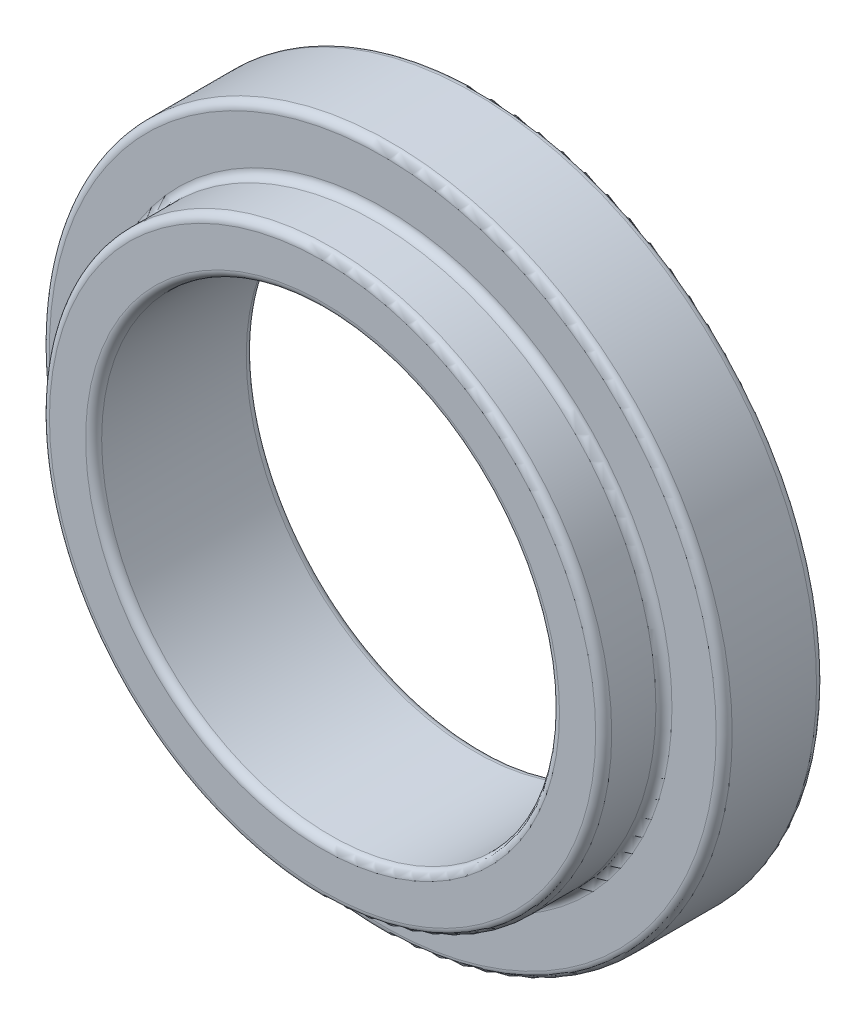
ISO-10303-21;
HEADER;
FILE_DESCRIPTION(('STEP AP214'),'2;1');
FILE_NAME('part.step','',(''),(''),'','','');
FILE_SCHEMA(('AUTOMOTIVE_DESIGN { 1 0 10303 214 1 1 1 1 }'));
ENDSEC;
DATA;
#1=APPLICATION_CONTEXT('core data for automotive mechanical design processes');
#2=APPLICATION_PROTOCOL_DEFINITION('international standard','automotive_design',2000,#1);
#3=PRODUCT_CONTEXT('',#1,'mechanical');
#4=PRODUCT('Part','Part','',(#3));
#5=PRODUCT_RELATED_PRODUCT_CATEGORY('part','',(#4));
#6=PRODUCT_DEFINITION_FORMATION('','',#4);
#7=PRODUCT_DEFINITION_CONTEXT('part definition',#1,'design');
#8=PRODUCT_DEFINITION('design','',#6,#7);
#9=PRODUCT_DEFINITION_SHAPE('','',#8);
#10=(LENGTH_UNIT() NAMED_UNIT(*) SI_UNIT(.MILLI.,.METRE.));
#11=(NAMED_UNIT(*) PLANE_ANGLE_UNIT() SI_UNIT($,.RADIAN.));
#12=(NAMED_UNIT(*) SI_UNIT($,.STERADIAN.) SOLID_ANGLE_UNIT());
#13=UNCERTAINTY_MEASURE_WITH_UNIT(LENGTH_MEASURE(1.E-05),#10,'distance_accuracy_value','');
#14=(GEOMETRIC_REPRESENTATION_CONTEXT(3) GLOBAL_UNCERTAINTY_ASSIGNED_CONTEXT((#13)) GLOBAL_UNIT_ASSIGNED_CONTEXT((#10,
#11,#12)) REPRESENTATION_CONTEXT('',''));
#15=CARTESIAN_POINT('',(0.,0.,0.));
#16=DIRECTION('',(0.,0.,1.));
#17=DIRECTION('',(1.,0.,0.));
#18=AXIS2_PLACEMENT_3D('',#15,#16,#17);
#19=CARTESIAN_POINT('',(0.,0.,40.));
#20=DIRECTION('',(0.,0.,-1.));
#21=DIRECTION('',(-1.,0.,0.));
#22=AXIS2_PLACEMENT_3D('',#19,#20,#21);
#23=CYLINDRICAL_SURFACE('',#22,85.);
#24=CARTESIAN_POINT('',(0.,0.,2.));
#25=DIRECTION('',(0.,0.,1.));
#26=DIRECTION('',(1.,0.,0.));
#27=AXIS2_PLACEMENT_3D('',#24,#25,#26);
#28=CIRCLE('',#27,85.);
#29=CARTESIAN_POINT('',(85.,0.,2.));
#30=VERTEX_POINT('',#29);
#31=EDGE_CURVE('E69',#30,#30,#28,.T.);
#32=ORIENTED_EDGE('',*,*,#31,.T.);
#33=EDGE_LOOP('',(#32));
#34=FACE_BOUND('',#33,.T.);
#35=CARTESIAN_POINT('',(0.,0.,23.));
#36=DIRECTION('',(0.,0.,1.));
#37=DIRECTION('',(1.,0.,0.));
#38=AXIS2_PLACEMENT_3D('',#35,#36,#37);
#39=CIRCLE('',#38,85.);
#40=CARTESIAN_POINT('',(85.,0.,23.));
#41=VERTEX_POINT('',#40);
#42=EDGE_CURVE('E72',#41,#41,#39,.F.);
#43=ORIENTED_EDGE('',*,*,#42,.T.);
#44=EDGE_LOOP('',(#43));
#45=FACE_BOUND('',#44,.T.);
#46=ADVANCED_FACE('F31',(#34,#45),#23,.T.);
#47=CARTESIAN_POINT('',(0.,0.,40.));
#48=DIRECTION('',(0.,0.,1.));
#49=DIRECTION('',(1.,0.,0.));
#50=AXIS2_PLACEMENT_3D('',#47,#48,#49);
#51=PLANE('',#50);
#52=CARTESIAN_POINT('',(0.,0.,40.));
#53=DIRECTION('',(0.,0.,1.));
#54=DIRECTION('',(1.,0.,0.));
#55=AXIS2_PLACEMENT_3D('',#52,#53,#54);
#56=CIRCLE('',#55,68.);
#57=CARTESIAN_POINT('',(68.,0.,40.));
#58=VERTEX_POINT('',#57);
#59=EDGE_CURVE('E51',#58,#58,#56,.T.);
#60=ORIENTED_EDGE('',*,*,#59,.T.);
#61=EDGE_LOOP('',(#60));
#62=FACE_BOUND('',#61,.T.);
#63=CARTESIAN_POINT('',(0.,0.,40.));
#64=DIRECTION('',(0.,0.,1.));
#65=DIRECTION('',(1.,0.,0.));
#66=AXIS2_PLACEMENT_3D('',#63,#64,#65);
#67=CIRCLE('',#66,59.);
#68=CARTESIAN_POINT('',(59.,0.,40.));
#69=VERTEX_POINT('',#68);
#70=EDGE_CURVE('E54',#69,#69,#67,.F.);
#71=ORIENTED_EDGE('',*,*,#70,.T.);
#72=EDGE_LOOP('',(#71));
#73=FACE_BOUND('',#72,.T.);
#74=ADVANCED_FACE('F90',(#62,#73),#51,.T.);
#75=CARTESIAN_POINT('',(0.,0.,0.));
#76=DIRECTION('',(0.,0.,1.));
#77=DIRECTION('',(1.,0.,0.));
#78=AXIS2_PLACEMENT_3D('',#75,#76,#77);
#79=PLANE('',#78);
#80=CARTESIAN_POINT('',(0.,0.,0.));
#81=DIRECTION('',(0.,0.,1.));
#82=DIRECTION('',(1.,0.,0.));
#83=AXIS2_PLACEMENT_3D('',#80,#81,#82);
#84=CIRCLE('',#83,83.);
#85=CARTESIAN_POINT('',(83.,0.,0.));
#86=VERTEX_POINT('',#85);
#87=EDGE_CURVE('E63',#86,#86,#84,.F.);
#88=ORIENTED_EDGE('',*,*,#87,.T.);
#89=EDGE_LOOP('',(#88));
#90=FACE_BOUND('',#89,.T.);
#91=CARTESIAN_POINT('',(0.,0.,0.));
#92=DIRECTION('',(0.,0.,1.));
#93=DIRECTION('',(1.,0.,0.));
#94=AXIS2_PLACEMENT_3D('',#91,#92,#93);
#95=CIRCLE('',#94,59.);
#96=CARTESIAN_POINT('',(59.,0.,0.));
#97=VERTEX_POINT('',#96);
#98=EDGE_CURVE('E66',#97,#97,#95,.T.);
#99=ORIENTED_EDGE('',*,*,#98,.T.);
#100=EDGE_LOOP('',(#99));
#101=FACE_BOUND('',#100,.T.);
#102=ADVANCED_FACE('F96',(#90,#101),#79,.F.);
#103=CARTESIAN_POINT('',(0.,0.,0.));
#104=DIRECTION('',(0.,0.,1.));
#105=DIRECTION('',(1.,0.,0.));
#106=AXIS2_PLACEMENT_3D('',#103,#104,#105);
#107=CYLINDRICAL_SURFACE('',#106,57.);
#108=CARTESIAN_POINT('',(0.,0.,2.));
#109=DIRECTION('',(0.,0.,1.));
#110=DIRECTION('',(1.,0.,0.));
#111=AXIS2_PLACEMENT_3D('',#108,#109,#110);
#112=CIRCLE('',#111,57.);
#113=CARTESIAN_POINT('',(57.,0.,2.));
#114=VERTEX_POINT('',#113);
#115=EDGE_CURVE('E57',#114,#114,#112,.F.);
#116=ORIENTED_EDGE('',*,*,#115,.T.);
#117=EDGE_LOOP('',(#116));
#118=FACE_BOUND('',#117,.T.);
#119=CARTESIAN_POINT('',(0.,0.,38.));
#120=DIRECTION('',(0.,0.,1.));
#121=DIRECTION('',(1.,0.,0.));
#122=AXIS2_PLACEMENT_3D('',#119,#120,#121);
#123=CIRCLE('',#122,57.);
#124=CARTESIAN_POINT('',(57.,0.,38.));
#125=VERTEX_POINT('',#124);
#126=EDGE_CURVE('E60',#125,#125,#123,.T.);
#127=ORIENTED_EDGE('',*,*,#126,.T.);
#128=EDGE_LOOP('',(#127));
#129=FACE_BOUND('',#128,.T.);
#130=ADVANCED_FACE('F122',(#118,#129),#107,.F.);
#131=CARTESIAN_POINT('',(0.,0.,25.));
#132=DIRECTION('',(0.,0.,1.));
#133=DIRECTION('',(1.,0.,0.));
#134=AXIS2_PLACEMENT_3D('',#131,#132,#133);
#135=PLANE('',#134);
#136=CARTESIAN_POINT('',(0.,0.,25.));
#137=DIRECTION('',(0.,0.,1.));
#138=DIRECTION('',(1.,0.,0.));
#139=AXIS2_PLACEMENT_3D('',#136,#137,#138);
#140=CIRCLE('',#139,83.);
#141=CARTESIAN_POINT('',(83.,0.,25.));
#142=VERTEX_POINT('',#141);
#143=EDGE_CURVE('E10',#142,#142,#140,.T.);
#144=ORIENTED_EDGE('',*,*,#143,.T.);
#145=EDGE_LOOP('',(#144));
#146=FACE_BOUND('',#145,.T.);
#147=CARTESIAN_POINT('',(0.,0.,25.));
#148=DIRECTION('',(0.,0.,1.));
#149=DIRECTION('',(1.,0.,0.));
#150=AXIS2_PLACEMENT_3D('',#147,#148,#149);
#151=CIRCLE('',#150,72.);
#152=CARTESIAN_POINT('',(72.,0.,25.));
#153=VERTEX_POINT('',#152);
#154=EDGE_CURVE('E38',#153,#153,#151,.F.);
#155=ORIENTED_EDGE('',*,*,#154,.T.);
#156=EDGE_LOOP('',(#155));
#157=FACE_BOUND('',#156,.T.);
#158=ADVANCED_FACE('F124',(#146,#157),#135,.T.);
#159=CARTESIAN_POINT('',(0.,0.,25.));
#160=DIRECTION('',(0.,0.,1.));
#161=DIRECTION('',(1.,0.,0.));
#162=AXIS2_PLACEMENT_3D('',#159,#160,#161);
#163=CYLINDRICAL_SURFACE('',#162,70.);
#164=CARTESIAN_POINT('',(0.,0.,38.));
#165=DIRECTION('',(0.,0.,1.));
#166=DIRECTION('',(1.,0.,0.));
#167=AXIS2_PLACEMENT_3D('',#164,#165,#166);
#168=CIRCLE('',#167,70.);
#169=CARTESIAN_POINT('',(70.,0.,38.));
#170=VERTEX_POINT('',#169);
#171=EDGE_CURVE('E42',#170,#170,#168,.F.);
#172=ORIENTED_EDGE('',*,*,#171,.T.);
#173=EDGE_LOOP('',(#172));
#174=FACE_BOUND('',#173,.T.);
#175=CARTESIAN_POINT('',(0.,0.,27.));
#176=DIRECTION('',(0.,0.,1.));
#177=DIRECTION('',(1.,0.,0.));
#178=AXIS2_PLACEMENT_3D('',#175,#176,#177);
#179=CIRCLE('',#178,70.);
#180=CARTESIAN_POINT('',(70.,0.,27.));
#181=VERTEX_POINT('',#180);
#182=EDGE_CURVE('E46',#181,#181,#179,.T.);
#183=ORIENTED_EDGE('',*,*,#182,.T.);
#184=EDGE_LOOP('',(#183));
#185=FACE_BOUND('',#184,.T.);
#186=ADVANCED_FACE('F105',(#174,#185),#163,.T.);
#187=CARTESIAN_POINT('',(0.,0.,2.));
#188=DIRECTION('',(0.,0.,1.));
#189=DIRECTION('',(1.,0.,0.));
#190=AXIS2_PLACEMENT_3D('',#187,#188,#189);
#191=TOROIDAL_SURFACE('',#190,83.,2.);
#192=ORIENTED_EDGE('',*,*,#87,.F.);
#193=EDGE_LOOP('',(#192));
#194=FACE_BOUND('',#193,.T.);
#195=ORIENTED_EDGE('',*,*,#31,.F.);
#196=EDGE_LOOP('',(#195));
#197=FACE_BOUND('',#196,.T.);
#198=ADVANCED_FACE('F101',(#194,#197),#191,.T.);
#199=CARTESIAN_POINT('',(0.,0.,2.));
#200=DIRECTION('',(0.,0.,1.));
#201=DIRECTION('',(1.,0.,0.));
#202=AXIS2_PLACEMENT_3D('',#199,#200,#201);
#203=TOROIDAL_SURFACE('',#202,59.,2.);
#204=ORIENTED_EDGE('',*,*,#115,.F.);
#205=EDGE_LOOP('',(#204));
#206=FACE_BOUND('',#205,.T.);
#207=ORIENTED_EDGE('',*,*,#98,.F.);
#208=EDGE_LOOP('',(#207));
#209=FACE_BOUND('',#208,.T.);
#210=ADVANCED_FACE('F104',(#206,#209),#203,.T.);
#211=CARTESIAN_POINT('',(0.,0.,38.));
#212=DIRECTION('',(0.,0.,1.));
#213=DIRECTION('',(1.,0.,0.));
#214=AXIS2_PLACEMENT_3D('',#211,#212,#213);
#215=TOROIDAL_SURFACE('',#214,68.,2.);
#216=ORIENTED_EDGE('',*,*,#171,.F.);
#217=EDGE_LOOP('',(#216));
#218=FACE_BOUND('',#217,.T.);
#219=ORIENTED_EDGE('',*,*,#59,.F.);
#220=EDGE_LOOP('',(#219));
#221=FACE_BOUND('',#220,.T.);
#222=ADVANCED_FACE('F86',(#218,#221),#215,.T.);
#223=CARTESIAN_POINT('',(0.,0.,38.));
#224=DIRECTION('',(0.,0.,1.));
#225=DIRECTION('',(1.,0.,0.));
#226=AXIS2_PLACEMENT_3D('',#223,#224,#225);
#227=TOROIDAL_SURFACE('',#226,59.,2.);
#228=ORIENTED_EDGE('',*,*,#70,.F.);
#229=EDGE_LOOP('',(#228));
#230=FACE_BOUND('',#229,.T.);
#231=ORIENTED_EDGE('',*,*,#126,.F.);
#232=EDGE_LOOP('',(#231));
#233=FACE_BOUND('',#232,.T.);
#234=ADVANCED_FACE('F80',(#230,#233),#227,.T.);
#235=CARTESIAN_POINT('',(0.,0.,23.));
#236=DIRECTION('',(0.,0.,1.));
#237=DIRECTION('',(1.,0.,0.));
#238=AXIS2_PLACEMENT_3D('',#235,#236,#237);
#239=TOROIDAL_SURFACE('',#238,83.,2.);
#240=ORIENTED_EDGE('',*,*,#42,.F.);
#241=EDGE_LOOP('',(#240));
#242=FACE_BOUND('',#241,.T.);
#243=ORIENTED_EDGE('',*,*,#143,.F.);
#244=EDGE_LOOP('',(#243));
#245=FACE_BOUND('',#244,.T.);
#246=ADVANCED_FACE('F77',(#242,#245),#239,.T.);
#247=CARTESIAN_POINT('',(0.,0.,27.));
#248=DIRECTION('',(0.,0.,1.));
#249=DIRECTION('',(1.,0.,0.));
#250=AXIS2_PLACEMENT_3D('',#247,#248,#249);
#251=TOROIDAL_SURFACE('',#250,72.,2.);
#252=ORIENTED_EDGE('',*,*,#154,.F.);
#253=EDGE_LOOP('',(#252));
#254=FACE_BOUND('',#253,.T.);
#255=ORIENTED_EDGE('',*,*,#182,.F.);
#256=EDGE_LOOP('',(#255));
#257=FACE_BOUND('',#256,.T.);
#258=ADVANCED_FACE('F33',(#254,#257),#251,.F.);
#259=CLOSED_SHELL('',(#46,#74,#102,#130,#158,#186,#198,#210,#222,#234,#246,#258));
#260=MANIFOLD_SOLID_BREP('B2',#259);
#261=ADVANCED_BREP_SHAPE_REPRESENTATION('',(#18,#260),#14);
#262=SHAPE_DEFINITION_REPRESENTATION(#9,#261);
ENDSEC;
END-ISO-10303-21;
